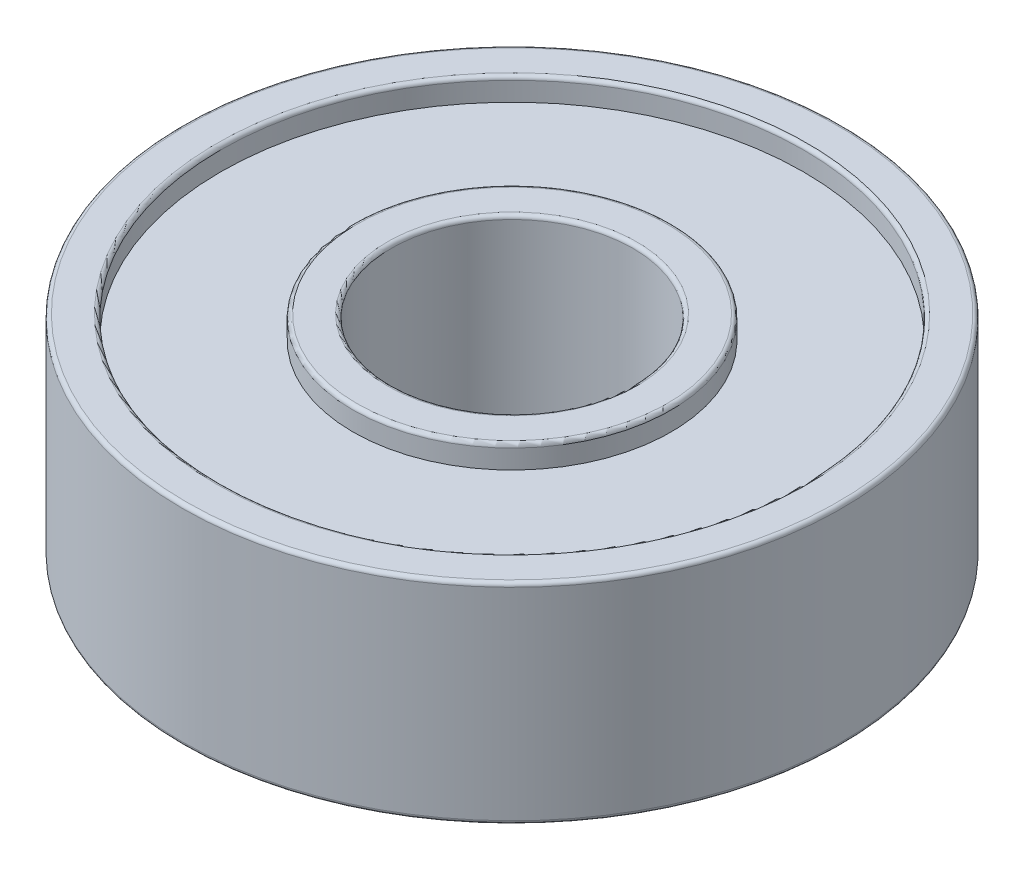
ISO-10303-21;
HEADER;
FILE_DESCRIPTION(('STEP AP214'),'2;1');
FILE_NAME('part.step','',(''),(''),'','','');
FILE_SCHEMA(('AUTOMOTIVE_DESIGN { 1 0 10303 214 1 1 1 1 }'));
ENDSEC;
DATA;
#1=APPLICATION_CONTEXT('core data for automotive mechanical design processes');
#2=APPLICATION_PROTOCOL_DEFINITION('international standard','automotive_design',2000,#1);
#3=PRODUCT_CONTEXT('',#1,'mechanical');
#4=PRODUCT('Part','Part','',(#3));
#5=PRODUCT_RELATED_PRODUCT_CATEGORY('part','',(#4));
#6=PRODUCT_DEFINITION_FORMATION('','',#4);
#7=PRODUCT_DEFINITION_CONTEXT('part definition',#1,'design');
#8=PRODUCT_DEFINITION('design','',#6,#7);
#9=PRODUCT_DEFINITION_SHAPE('','',#8);
#10=(LENGTH_UNIT() NAMED_UNIT(*) SI_UNIT(.MILLI.,.METRE.));
#11=(NAMED_UNIT(*) PLANE_ANGLE_UNIT() SI_UNIT($,.RADIAN.));
#12=(NAMED_UNIT(*) SI_UNIT($,.STERADIAN.) SOLID_ANGLE_UNIT());
#13=UNCERTAINTY_MEASURE_WITH_UNIT(LENGTH_MEASURE(1.E-05),#10,'distance_accuracy_value','');
#14=(GEOMETRIC_REPRESENTATION_CONTEXT(3) GLOBAL_UNCERTAINTY_ASSIGNED_CONTEXT((#13)) GLOBAL_UNIT_ASSIGNED_CONTEXT((#10,
#11,#12)) REPRESENTATION_CONTEXT('',''));
#15=CARTESIAN_POINT('',(0.,0.,0.));
#16=DIRECTION('',(0.,0.,1.));
#17=DIRECTION('',(1.,0.,0.));
#18=AXIS2_PLACEMENT_3D('',#15,#16,#17);
#19=CARTESIAN_POINT('',(0.,-3.5,0.));
#20=DIRECTION('',(0.,1.,0.));
#21=DIRECTION('',(0.,0.,1.));
#22=AXIS2_PLACEMENT_3D('',#19,#20,#21);
#23=PLANE('',#22);
#24=CARTESIAN_POINT('',(0.,-3.5,0.));
#25=DIRECTION('',(0.,1.,0.));
#26=DIRECTION('',(0.,0.,1.));
#27=AXIS2_PLACEMENT_3D('',#24,#25,#26);
#28=CIRCLE('',#27,4.1656);
#29=CARTESIAN_POINT('',(0.,-3.5,4.1656));
#30=VERTEX_POINT('',#29);
#31=EDGE_CURVE('E88',#30,#30,#28,.T.);
#32=ORIENTED_EDGE('',*,*,#31,.T.);
#33=EDGE_LOOP('',(#32));
#34=FACE_BOUND('',#33,.T.);
#35=CARTESIAN_POINT('',(0.,-3.5,0.));
#36=DIRECTION('',(0.,1.,0.));
#37=DIRECTION('',(0.,0.,1.));
#38=AXIS2_PLACEMENT_3D('',#35,#36,#37);
#39=CIRCLE('',#38,5.1816);
#40=CARTESIAN_POINT('',(0.,-3.5,5.1816));
#41=VERTEX_POINT('',#40);
#42=EDGE_CURVE('E91',#41,#41,#39,.F.);
#43=ORIENTED_EDGE('',*,*,#42,.T.);
#44=EDGE_LOOP('',(#43));
#45=FACE_BOUND('',#44,.T.);
#46=ADVANCED_FACE('F38',(#34,#45),#23,.F.);
#47=CARTESIAN_POINT('',(0.,3.5,0.));
#48=DIRECTION('',(0.,1.,0.));
#49=DIRECTION('',(0.,0.,1.));
#50=AXIS2_PLACEMENT_3D('',#47,#48,#49);
#51=PLANE('',#50);
#52=CARTESIAN_POINT('',(0.,3.5,0.));
#53=DIRECTION('',(0.,1.,0.));
#54=DIRECTION('',(0.,0.,1.));
#55=AXIS2_PLACEMENT_3D('',#52,#53,#54);
#56=CIRCLE('',#55,4.1656);
#57=CARTESIAN_POINT('',(0.,3.5,4.1656));
#58=VERTEX_POINT('',#57);
#59=EDGE_CURVE('E76',#58,#58,#56,.F.);
#60=ORIENTED_EDGE('',*,*,#59,.T.);
#61=EDGE_LOOP('',(#60));
#62=FACE_BOUND('',#61,.T.);
#63=CARTESIAN_POINT('',(0.,3.5,0.));
#64=DIRECTION('',(0.,1.,0.));
#65=DIRECTION('',(0.,0.,1.));
#66=AXIS2_PLACEMENT_3D('',#63,#64,#65);
#67=CIRCLE('',#66,5.1816);
#68=CARTESIAN_POINT('',(0.,3.5,5.1816));
#69=VERTEX_POINT('',#68);
#70=EDGE_CURVE('E79',#69,#69,#67,.T.);
#71=ORIENTED_EDGE('',*,*,#70,.T.);
#72=EDGE_LOOP('',(#71));
#73=FACE_BOUND('',#72,.T.);
#74=ADVANCED_FACE('F127',(#62,#73),#51,.T.);
#75=CARTESIAN_POINT('',(0.,-3.5,0.));
#76=DIRECTION('',(0.,1.,0.));
#77=DIRECTION('',(0.,0.,1.));
#78=AXIS2_PLACEMENT_3D('',#75,#76,#77);
#79=CYLINDRICAL_SURFACE('',#78,11.);
#80=CARTESIAN_POINT('',(0.,-3.373,0.));
#81=DIRECTION('',(0.,1.,0.));
#82=DIRECTION('',(0.,0.,1.));
#83=AXIS2_PLACEMENT_3D('',#80,#81,#82);
#84=CIRCLE('',#83,11.);
#85=CARTESIAN_POINT('',(0.,-3.373,11.));
#86=VERTEX_POINT('',#85);
#87=EDGE_CURVE('E58',#86,#86,#84,.T.);
#88=ORIENTED_EDGE('',*,*,#87,.T.);
#89=EDGE_LOOP('',(#88));
#90=FACE_BOUND('',#89,.T.);
#91=CARTESIAN_POINT('',(0.,3.373,0.));
#92=DIRECTION('',(0.,1.,0.));
#93=DIRECTION('',(0.,0.,1.));
#94=AXIS2_PLACEMENT_3D('',#91,#92,#93);
#95=CIRCLE('',#94,11.);
#96=CARTESIAN_POINT('',(0.,3.373,11.));
#97=VERTEX_POINT('',#96);
#98=EDGE_CURVE('E61',#97,#97,#95,.F.);
#99=ORIENTED_EDGE('',*,*,#98,.T.);
#100=EDGE_LOOP('',(#99));
#101=FACE_BOUND('',#100,.T.);
#102=ADVANCED_FACE('F134',(#90,#101),#79,.T.);
#103=CARTESIAN_POINT('',(0.,-3.5,0.));
#104=DIRECTION('',(0.,1.,0.));
#105=DIRECTION('',(0.,0.,1.));
#106=AXIS2_PLACEMENT_3D('',#103,#104,#105);
#107=CIRCLE('',#106,9.857);
#108=CARTESIAN_POINT('',(0.,-3.5,9.857));
#109=VERTEX_POINT('',#108);
#110=EDGE_CURVE('E64',#109,#109,#107,.T.);
#111=ORIENTED_EDGE('',*,*,#110,.T.);
#112=EDGE_LOOP('',(#111));
#113=FACE_BOUND('',#112,.T.);
#114=CARTESIAN_POINT('',(0.,-3.5,0.));
#115=DIRECTION('',(0.,1.,0.));
#116=DIRECTION('',(0.,0.,1.));
#117=AXIS2_PLACEMENT_3D('',#114,#115,#116);
#118=CIRCLE('',#117,10.873);
#119=CARTESIAN_POINT('',(0.,-3.5,10.873));
#120=VERTEX_POINT('',#119);
#121=EDGE_CURVE('E67',#120,#120,#118,.F.);
#122=ORIENTED_EDGE('',*,*,#121,.T.);
#123=EDGE_LOOP('',(#122));
#124=FACE_BOUND('',#123,.T.);
#125=ADVANCED_FACE('F130',(#113,#124),#23,.F.);
#126=CARTESIAN_POINT('',(0.,-3.5,0.));
#127=DIRECTION('',(0.,1.,0.));
#128=DIRECTION('',(0.,0.,1.));
#129=AXIS2_PLACEMENT_3D('',#126,#127,#128);
#130=CYLINDRICAL_SURFACE('',#129,4.0386);
#131=CARTESIAN_POINT('',(0.,-3.373,0.));
#132=DIRECTION('',(0.,1.,0.));
#133=DIRECTION('',(0.,0.,1.));
#134=AXIS2_PLACEMENT_3D('',#131,#132,#133);
#135=CIRCLE('',#134,4.0386);
#136=CARTESIAN_POINT('',(0.,-3.373,4.0386));
#137=VERTEX_POINT('',#136);
#138=EDGE_CURVE('E82',#137,#137,#135,.F.);
#139=ORIENTED_EDGE('',*,*,#138,.T.);
#140=EDGE_LOOP('',(#139));
#141=FACE_BOUND('',#140,.T.);
#142=CARTESIAN_POINT('',(0.,3.373,0.));
#143=DIRECTION('',(0.,1.,0.));
#144=DIRECTION('',(0.,0.,1.));
#145=AXIS2_PLACEMENT_3D('',#142,#143,#144);
#146=CIRCLE('',#145,4.0386);
#147=CARTESIAN_POINT('',(0.,3.373,4.0386));
#148=VERTEX_POINT('',#147);
#149=EDGE_CURVE('E85',#148,#148,#146,.T.);
#150=ORIENTED_EDGE('',*,*,#149,.T.);
#151=EDGE_LOOP('',(#150));
#152=FACE_BOUND('',#151,.T.);
#153=ADVANCED_FACE('F142',(#141,#152),#130,.F.);
#154=CARTESIAN_POINT('',(0.,3.5,0.));
#155=DIRECTION('',(0.,1.,0.));
#156=DIRECTION('',(0.,0.,1.));
#157=AXIS2_PLACEMENT_3D('',#154,#155,#156);
#158=CIRCLE('',#157,9.857);
#159=CARTESIAN_POINT('',(0.,3.5,9.857));
#160=VERTEX_POINT('',#159);
#161=EDGE_CURVE('E10',#160,#160,#158,.F.);
#162=ORIENTED_EDGE('',*,*,#161,.T.);
#163=EDGE_LOOP('',(#162));
#164=FACE_BOUND('',#163,.T.);
#165=CARTESIAN_POINT('',(0.,3.5,0.));
#166=DIRECTION('',(0.,1.,0.));
#167=DIRECTION('',(0.,0.,1.));
#168=AXIS2_PLACEMENT_3D('',#165,#166,#167);
#169=CIRCLE('',#168,10.873);
#170=CARTESIAN_POINT('',(0.,3.5,10.873));
#171=VERTEX_POINT('',#170);
#172=EDGE_CURVE('E45',#171,#171,#169,.T.);
#173=ORIENTED_EDGE('',*,*,#172,.T.);
#174=EDGE_LOOP('',(#173));
#175=FACE_BOUND('',#174,.T.);
#176=ADVANCED_FACE('F137',(#164,#175),#51,.T.);
#177=CARTESIAN_POINT('',(0.,2.738,0.));
#178=DIRECTION('',(0.,1.,0.));
#179=DIRECTION('',(0.,0.,1.));
#180=AXIS2_PLACEMENT_3D('',#177,#178,#179);
#181=CYLINDRICAL_SURFACE('',#180,9.73);
#182=CARTESIAN_POINT('',(0.,3.373,0.));
#183=DIRECTION('',(0.,1.,0.));
#184=DIRECTION('',(0.,0.,1.));
#185=AXIS2_PLACEMENT_3D('',#182,#183,#184);
#186=CIRCLE('',#185,9.73);
#187=CARTESIAN_POINT('',(0.,3.373,9.73));
#188=VERTEX_POINT('',#187);
#189=EDGE_CURVE('E49',#188,#188,#186,.T.);
#190=CARTESIAN_POINT('',(0.,2.738,0.));
#191=DIRECTION('',(0.,1.,0.));
#192=DIRECTION('',(0.,0.,1.));
#193=AXIS2_PLACEMENT_3D('',#190,#191,#192);
#194=CIRCLE('',#193,9.73);
#195=CARTESIAN_POINT('',(0.,2.738,9.73));
#196=VERTEX_POINT('',#195);
#197=EDGE_CURVE('E94',#196,#196,#194,.T.);
#198=CARTESIAN_POINT('',(0.,3.373,9.73));
#199=CARTESIAN_POINT('',(0.,3.36638541666667,9.73));
#200=CARTESIAN_POINT('',(0.,3.35977083333333,9.73));
#201=CARTESIAN_POINT('',(0.,3.34654166666667,9.73));
#202=CARTESIAN_POINT('',(0.,3.33992708333333,9.73));
#203=CARTESIAN_POINT('',(0.,3.32669791666667,9.73));
#204=CARTESIAN_POINT('',(0.,3.32008333333333,9.73));
#205=CARTESIAN_POINT('',(0.,3.30685416666667,9.73));
#206=CARTESIAN_POINT('',(0.,3.30023958333333,9.73));
#207=CARTESIAN_POINT('',(0.,3.28701041666667,9.73));
#208=CARTESIAN_POINT('',(0.,3.28039583333333,9.73));
#209=CARTESIAN_POINT('',(0.,3.26716666666667,9.73));
#210=CARTESIAN_POINT('',(0.,3.26055208333333,9.73));
#211=CARTESIAN_POINT('',(0.,3.24732291666667,9.73));
#212=CARTESIAN_POINT('',(0.,3.24070833333333,9.73));
#213=CARTESIAN_POINT('',(0.,3.22747916666667,9.73));
#214=CARTESIAN_POINT('',(0.,3.22086458333333,9.73));
#215=CARTESIAN_POINT('',(0.,3.20763541666667,9.73));
#216=CARTESIAN_POINT('',(0.,3.20102083333333,9.73));
#217=CARTESIAN_POINT('',(0.,3.18779166666667,9.73));
#218=CARTESIAN_POINT('',(0.,3.18117708333333,9.73));
#219=CARTESIAN_POINT('',(0.,3.16794791666667,9.73));
#220=CARTESIAN_POINT('',(0.,3.16133333333333,9.73));
#221=CARTESIAN_POINT('',(0.,3.14810416666667,9.73));
#222=CARTESIAN_POINT('',(0.,3.14148958333333,9.73));
#223=CARTESIAN_POINT('',(0.,3.12826041666667,9.73));
#224=CARTESIAN_POINT('',(0.,3.12164583333333,9.73));
#225=CARTESIAN_POINT('',(0.,3.10841666666667,9.73));
#226=CARTESIAN_POINT('',(0.,3.10180208333333,9.73));
#227=CARTESIAN_POINT('',(0.,3.08857291666667,9.73));
#228=CARTESIAN_POINT('',(0.,3.08195833333333,9.73));
#229=CARTESIAN_POINT('',(0.,3.06872916666667,9.73));
#230=CARTESIAN_POINT('',(0.,3.06211458333333,9.73));
#231=CARTESIAN_POINT('',(0.,3.04888541666667,9.73));
#232=CARTESIAN_POINT('',(0.,3.04227083333333,9.73));
#233=CARTESIAN_POINT('',(0.,3.02904166666667,9.73));
#234=CARTESIAN_POINT('',(0.,3.02242708333333,9.73));
#235=CARTESIAN_POINT('',(0.,3.00919791666667,9.73));
#236=CARTESIAN_POINT('',(0.,3.00258333333333,9.73));
#237=CARTESIAN_POINT('',(0.,2.98935416666667,9.73));
#238=CARTESIAN_POINT('',(0.,2.98273958333333,9.73));
#239=CARTESIAN_POINT('',(0.,2.96951041666667,9.73));
#240=CARTESIAN_POINT('',(0.,2.96289583333333,9.73));
#241=CARTESIAN_POINT('',(0.,2.94966666666667,9.73));
#242=CARTESIAN_POINT('',(0.,2.94305208333333,9.73));
#243=CARTESIAN_POINT('',(0.,2.92982291666667,9.73));
#244=CARTESIAN_POINT('',(0.,2.92320833333333,9.73));
#245=CARTESIAN_POINT('',(0.,2.90997916666667,9.73));
#246=CARTESIAN_POINT('',(0.,2.90336458333333,9.73));
#247=CARTESIAN_POINT('',(0.,2.89013541666667,9.73));
#248=CARTESIAN_POINT('',(0.,2.88352083333333,9.73));
#249=CARTESIAN_POINT('',(0.,2.87029166666667,9.73));
#250=CARTESIAN_POINT('',(0.,2.86367708333333,9.73));
#251=CARTESIAN_POINT('',(0.,2.85044791666667,9.73));
#252=CARTESIAN_POINT('',(0.,2.84383333333333,9.73));
#253=CARTESIAN_POINT('',(0.,2.83060416666667,9.73));
#254=CARTESIAN_POINT('',(0.,2.82398958333333,9.73));
#255=CARTESIAN_POINT('',(0.,2.81076041666667,9.73));
#256=CARTESIAN_POINT('',(0.,2.80414583333333,9.73));
#257=CARTESIAN_POINT('',(0.,2.79091666666667,9.73));
#258=CARTESIAN_POINT('',(0.,2.78430208333333,9.73));
#259=CARTESIAN_POINT('',(0.,2.77107291666667,9.73));
#260=CARTESIAN_POINT('',(0.,2.76445833333333,9.73));
#261=CARTESIAN_POINT('',(0.,2.75122916666667,9.73));
#262=CARTESIAN_POINT('',(0.,2.74461458333333,9.73));
#263=CARTESIAN_POINT('',(0.,2.738,9.73));
#264=B_SPLINE_CURVE_WITH_KNOTS('',3,(#198,#199,#200,#201,#202,#203,#204,#205,#206,#207,#208,
#209,#210,#211,#212,#213,#214,#215,#216,#217,#218,#219,#220,#221,#222,#223,#224,#225,#226,#227,
#228,#229,#230,#231,#232,#233,#234,#235,#236,#237,#238,#239,#240,#241,#242,#243,#244,#245,#246,
#247,#248,#249,#250,#251,#252,#253,#254,#255,#256,#257,#258,#259,#260,#261,#262,#263),
.UNSPECIFIED.,.F.,.F.,(4,2,2,2,2,2,2,2,2,2,2,2,2,2,2,2,2,2,2,2,2,2,2,2,2,2,2,2,2,2,2,2,4),(0.,
0.0198437499999999,0.0396874999999998,0.0595312500000001,0.079375,0.0992187499999999,0.1190625,
0.13890625,0.15875,0.17859375,0.1984375,0.21828125,0.238125,0.25796875,0.2778125,0.29765625,
0.3175,0.33734375,0.3571875,0.37703125,0.396875,0.41671875,0.4365625,0.45640625,0.47625,
0.49609375,0.5159375,0.53578125,0.555625,0.57546875,0.5953125,0.61515625,0.635),.UNSPECIFIED.);
#265=EDGE_CURVE('BSEAM233',#188,#196,#264,.T.);
#266=ORIENTED_EDGE('',*,*,#189,.T.);
#267=ORIENTED_EDGE('',*,*,#197,.F.);
#268=ORIENTED_EDGE('',*,*,#265,.T.);
#269=ORIENTED_EDGE('',*,*,#265,.F.);
#270=EDGE_LOOP('',(#266,#268,#267,#269));
#271=FACE_BOUND('',#270,.T.);
#272=ADVANCED_FACE('F233',(#271),#181,.F.);
#273=CARTESIAN_POINT('',(0.,2.738,0.));
#274=DIRECTION('',(0.,1.,0.));
#275=DIRECTION('',(0.,0.,1.));
#276=AXIS2_PLACEMENT_3D('',#273,#274,#275);
#277=PLANE('',#276);
#278=CARTESIAN_POINT('',(0.,2.738,0.));
#279=DIRECTION('',(0.,1.,0.));
#280=DIRECTION('',(0.,0.,1.));
#281=AXIS2_PLACEMENT_3D('',#278,#279,#280);
#282=CIRCLE('',#281,5.3086);
#283=CARTESIAN_POINT('',(0.,2.738,5.3086));
#284=VERTEX_POINT('',#283);
#285=EDGE_CURVE('E97',#284,#284,#282,.T.);
#286=ORIENTED_EDGE('',*,*,#285,.F.);
#287=EDGE_LOOP('',(#286));
#288=FACE_BOUND('',#287,.T.);
#289=ORIENTED_EDGE('',*,*,#197,.T.);
#290=EDGE_LOOP('',(#289));
#291=FACE_BOUND('',#290,.T.);
#292=ADVANCED_FACE('F123',(#288,#291),#277,.T.);
#293=CARTESIAN_POINT('',(0.,2.738,0.));
#294=DIRECTION('',(0.,1.,0.));
#295=DIRECTION('',(0.,0.,1.));
#296=AXIS2_PLACEMENT_3D('',#293,#294,#295);
#297=CYLINDRICAL_SURFACE('',#296,5.3086);
#298=CARTESIAN_POINT('',(0.,3.373,0.));
#299=DIRECTION('',(0.,1.,0.));
#300=DIRECTION('',(0.,0.,1.));
#301=AXIS2_PLACEMENT_3D('',#298,#299,#300);
#302=CIRCLE('',#301,5.3086);
#303=CARTESIAN_POINT('',(0.,3.373,5.3086));
#304=VERTEX_POINT('',#303);
#305=EDGE_CURVE('E53',#304,#304,#302,.F.);
#306=CARTESIAN_POINT('',(0.,3.373,5.3086));
#307=CARTESIAN_POINT('',(0.,3.36638541666667,5.3086));
#308=CARTESIAN_POINT('',(0.,3.35977083333333,5.3086));
#309=CARTESIAN_POINT('',(0.,3.34654166666667,5.3086));
#310=CARTESIAN_POINT('',(0.,3.33992708333333,5.3086));
#311=CARTESIAN_POINT('',(0.,3.32669791666667,5.3086));
#312=CARTESIAN_POINT('',(0.,3.32008333333333,5.3086));
#313=CARTESIAN_POINT('',(0.,3.30685416666667,5.3086));
#314=CARTESIAN_POINT('',(0.,3.30023958333333,5.3086));
#315=CARTESIAN_POINT('',(0.,3.28701041666667,5.3086));
#316=CARTESIAN_POINT('',(0.,3.28039583333333,5.3086));
#317=CARTESIAN_POINT('',(0.,3.26716666666667,5.3086));
#318=CARTESIAN_POINT('',(0.,3.26055208333333,5.3086));
#319=CARTESIAN_POINT('',(0.,3.24732291666667,5.3086));
#320=CARTESIAN_POINT('',(0.,3.24070833333333,5.3086));
#321=CARTESIAN_POINT('',(0.,3.22747916666667,5.3086));
#322=CARTESIAN_POINT('',(0.,3.22086458333333,5.3086));
#323=CARTESIAN_POINT('',(0.,3.20763541666667,5.3086));
#324=CARTESIAN_POINT('',(0.,3.20102083333333,5.3086));
#325=CARTESIAN_POINT('',(0.,3.18779166666667,5.3086));
#326=CARTESIAN_POINT('',(0.,3.18117708333333,5.3086));
#327=CARTESIAN_POINT('',(0.,3.16794791666667,5.3086));
#328=CARTESIAN_POINT('',(0.,3.16133333333333,5.3086));
#329=CARTESIAN_POINT('',(0.,3.14810416666667,5.3086));
#330=CARTESIAN_POINT('',(0.,3.14148958333333,5.3086));
#331=CARTESIAN_POINT('',(0.,3.12826041666667,5.3086));
#332=CARTESIAN_POINT('',(0.,3.12164583333333,5.3086));
#333=CARTESIAN_POINT('',(0.,3.10841666666667,5.3086));
#334=CARTESIAN_POINT('',(0.,3.10180208333333,5.3086));
#335=CARTESIAN_POINT('',(0.,3.08857291666667,5.3086));
#336=CARTESIAN_POINT('',(0.,3.08195833333333,5.3086));
#337=CARTESIAN_POINT('',(0.,3.06872916666667,5.3086));
#338=CARTESIAN_POINT('',(0.,3.06211458333333,5.3086));
#339=CARTESIAN_POINT('',(0.,3.04888541666667,5.3086));
#340=CARTESIAN_POINT('',(0.,3.04227083333333,5.3086));
#341=CARTESIAN_POINT('',(0.,3.02904166666667,5.3086));
#342=CARTESIAN_POINT('',(0.,3.02242708333333,5.3086));
#343=CARTESIAN_POINT('',(0.,3.00919791666667,5.3086));
#344=CARTESIAN_POINT('',(0.,3.00258333333333,5.3086));
#345=CARTESIAN_POINT('',(0.,2.98935416666667,5.3086));
#346=CARTESIAN_POINT('',(0.,2.98273958333333,5.3086));
#347=CARTESIAN_POINT('',(0.,2.96951041666667,5.3086));
#348=CARTESIAN_POINT('',(0.,2.96289583333333,5.3086));
#349=CARTESIAN_POINT('',(0.,2.94966666666667,5.3086));
#350=CARTESIAN_POINT('',(0.,2.94305208333333,5.3086));
#351=CARTESIAN_POINT('',(0.,2.92982291666667,5.3086));
#352=CARTESIAN_POINT('',(0.,2.92320833333333,5.3086));
#353=CARTESIAN_POINT('',(0.,2.90997916666667,5.3086));
#354=CARTESIAN_POINT('',(0.,2.90336458333333,5.3086));
#355=CARTESIAN_POINT('',(0.,2.89013541666667,5.3086));
#356=CARTESIAN_POINT('',(0.,2.88352083333333,5.3086));
#357=CARTESIAN_POINT('',(0.,2.87029166666667,5.3086));
#358=CARTESIAN_POINT('',(0.,2.86367708333333,5.3086));
#359=CARTESIAN_POINT('',(0.,2.85044791666667,5.3086));
#360=CARTESIAN_POINT('',(0.,2.84383333333333,5.3086));
#361=CARTESIAN_POINT('',(0.,2.83060416666667,5.3086));
#362=CARTESIAN_POINT('',(0.,2.82398958333333,5.3086));
#363=CARTESIAN_POINT('',(0.,2.81076041666667,5.3086));
#364=CARTESIAN_POINT('',(0.,2.80414583333333,5.3086));
#365=CARTESIAN_POINT('',(0.,2.79091666666667,5.3086));
#366=CARTESIAN_POINT('',(0.,2.78430208333333,5.3086));
#367=CARTESIAN_POINT('',(0.,2.77107291666667,5.3086));
#368=CARTESIAN_POINT('',(0.,2.76445833333333,5.3086));
#369=CARTESIAN_POINT('',(0.,2.75122916666667,5.3086));
#370=CARTESIAN_POINT('',(0.,2.74461458333333,5.3086));
#371=CARTESIAN_POINT('',(0.,2.738,5.3086));
#372=B_SPLINE_CURVE_WITH_KNOTS('',3,(#306,#307,#308,#309,#310,#311,#312,#313,#314,#315,#316,
#317,#318,#319,#320,#321,#322,#323,#324,#325,#326,#327,#328,#329,#330,#331,#332,#333,#334,#335,
#336,#337,#338,#339,#340,#341,#342,#343,#344,#345,#346,#347,#348,#349,#350,#351,#352,#353,#354,
#355,#356,#357,#358,#359,#360,#361,#362,#363,#364,#365,#366,#367,#368,#369,#370,#371),
.UNSPECIFIED.,.F.,.F.,(4,2,2,2,2,2,2,2,2,2,2,2,2,2,2,2,2,2,2,2,2,2,2,2,2,2,2,2,2,2,2,2,4),(0.,
0.0198437499999999,0.0396874999999998,0.0595312500000001,0.079375,0.0992187499999999,0.1190625,
0.13890625,0.15875,0.17859375,0.1984375,0.21828125,0.238125,0.25796875,0.2778125,0.29765625,
0.3175,0.33734375,0.3571875,0.37703125,0.396875,0.41671875,0.4365625,0.45640625,0.47625,
0.49609375,0.5159375,0.53578125,0.555625,0.57546875,0.5953125,0.61515625,0.635),.UNSPECIFIED.);
#373=EDGE_CURVE('BSEAM117',#304,#284,#372,.T.);
#374=ORIENTED_EDGE('',*,*,#305,.T.);
#375=ORIENTED_EDGE('',*,*,#285,.T.);
#376=ORIENTED_EDGE('',*,*,#373,.T.);
#377=ORIENTED_EDGE('',*,*,#373,.F.);
#378=EDGE_LOOP('',(#374,#376,#375,#377));
#379=FACE_BOUND('',#378,.T.);
#380=ADVANCED_FACE('F117',(#379),#297,.T.);
#381=CARTESIAN_POINT('',(0.,-2.738,0.));
#382=DIRECTION('',(0.,-1.,0.));
#383=DIRECTION('',(0.,0.,-1.));
#384=AXIS2_PLACEMENT_3D('',#381,#382,#383);
#385=CYLINDRICAL_SURFACE('',#384,9.73);
#386=CARTESIAN_POINT('',(0.,-3.373,0.));
#387=DIRECTION('',(0.,1.,0.));
#388=DIRECTION('',(0.,0.,1.));
#389=AXIS2_PLACEMENT_3D('',#386,#387,#388);
#390=CIRCLE('',#389,9.73);
#391=CARTESIAN_POINT('',(0.,-3.373,-9.73));
#392=VERTEX_POINT('',#391);
#393=EDGE_CURVE('E70',#392,#392,#390,.F.);
#394=CARTESIAN_POINT('',(0.,-2.738,0.));
#395=DIRECTION('',(0.,-1.,0.));
#396=DIRECTION('',(0.,0.,-1.));
#397=AXIS2_PLACEMENT_3D('',#394,#395,#396);
#398=CIRCLE('',#397,9.73);
#399=CARTESIAN_POINT('',(0.,-2.738,-9.73));
#400=VERTEX_POINT('',#399);
#401=EDGE_CURVE('E100',#400,#400,#398,.T.);
#402=CARTESIAN_POINT('',(0.,-3.373,-9.73));
#403=CARTESIAN_POINT('',(0.,-3.36638541666667,-9.73));
#404=CARTESIAN_POINT('',(0.,-3.35977083333333,-9.73));
#405=CARTESIAN_POINT('',(0.,-3.34654166666667,-9.73));
#406=CARTESIAN_POINT('',(0.,-3.33992708333333,-9.73));
#407=CARTESIAN_POINT('',(0.,-3.32669791666667,-9.73));
#408=CARTESIAN_POINT('',(0.,-3.32008333333333,-9.73));
#409=CARTESIAN_POINT('',(0.,-3.30685416666667,-9.73));
#410=CARTESIAN_POINT('',(0.,-3.30023958333333,-9.73));
#411=CARTESIAN_POINT('',(0.,-3.28701041666667,-9.73));
#412=CARTESIAN_POINT('',(0.,-3.28039583333333,-9.73));
#413=CARTESIAN_POINT('',(0.,-3.26716666666667,-9.73));
#414=CARTESIAN_POINT('',(0.,-3.26055208333333,-9.73));
#415=CARTESIAN_POINT('',(0.,-3.24732291666667,-9.73));
#416=CARTESIAN_POINT('',(0.,-3.24070833333333,-9.73));
#417=CARTESIAN_POINT('',(0.,-3.22747916666667,-9.73));
#418=CARTESIAN_POINT('',(0.,-3.22086458333333,-9.73));
#419=CARTESIAN_POINT('',(0.,-3.20763541666667,-9.73));
#420=CARTESIAN_POINT('',(0.,-3.20102083333333,-9.73));
#421=CARTESIAN_POINT('',(0.,-3.18779166666667,-9.73));
#422=CARTESIAN_POINT('',(0.,-3.18117708333333,-9.73));
#423=CARTESIAN_POINT('',(0.,-3.16794791666667,-9.73));
#424=CARTESIAN_POINT('',(0.,-3.16133333333333,-9.73));
#425=CARTESIAN_POINT('',(0.,-3.14810416666667,-9.73));
#426=CARTESIAN_POINT('',(0.,-3.14148958333333,-9.73));
#427=CARTESIAN_POINT('',(0.,-3.12826041666667,-9.73));
#428=CARTESIAN_POINT('',(0.,-3.12164583333333,-9.73));
#429=CARTESIAN_POINT('',(0.,-3.10841666666667,-9.73));
#430=CARTESIAN_POINT('',(0.,-3.10180208333333,-9.73));
#431=CARTESIAN_POINT('',(0.,-3.08857291666667,-9.73));
#432=CARTESIAN_POINT('',(0.,-3.08195833333333,-9.73));
#433=CARTESIAN_POINT('',(0.,-3.06872916666667,-9.73));
#434=CARTESIAN_POINT('',(0.,-3.06211458333333,-9.73));
#435=CARTESIAN_POINT('',(0.,-3.04888541666667,-9.73));
#436=CARTESIAN_POINT('',(0.,-3.04227083333333,-9.73));
#437=CARTESIAN_POINT('',(0.,-3.02904166666667,-9.73));
#438=CARTESIAN_POINT('',(0.,-3.02242708333333,-9.73));
#439=CARTESIAN_POINT('',(0.,-3.00919791666667,-9.73));
#440=CARTESIAN_POINT('',(0.,-3.00258333333333,-9.73));
#441=CARTESIAN_POINT('',(0.,-2.98935416666667,-9.73));
#442=CARTESIAN_POINT('',(0.,-2.98273958333333,-9.73));
#443=CARTESIAN_POINT('',(0.,-2.96951041666667,-9.73));
#444=CARTESIAN_POINT('',(0.,-2.96289583333333,-9.73));
#445=CARTESIAN_POINT('',(0.,-2.94966666666667,-9.73));
#446=CARTESIAN_POINT('',(0.,-2.94305208333333,-9.73));
#447=CARTESIAN_POINT('',(0.,-2.92982291666667,-9.73));
#448=CARTESIAN_POINT('',(0.,-2.92320833333333,-9.73));
#449=CARTESIAN_POINT('',(0.,-2.90997916666667,-9.73));
#450=CARTESIAN_POINT('',(0.,-2.90336458333333,-9.73));
#451=CARTESIAN_POINT('',(0.,-2.89013541666667,-9.73));
#452=CARTESIAN_POINT('',(0.,-2.88352083333333,-9.73));
#453=CARTESIAN_POINT('',(0.,-2.87029166666667,-9.73));
#454=CARTESIAN_POINT('',(0.,-2.86367708333333,-9.73));
#455=CARTESIAN_POINT('',(0.,-2.85044791666667,-9.73));
#456=CARTESIAN_POINT('',(0.,-2.84383333333333,-9.73));
#457=CARTESIAN_POINT('',(0.,-2.83060416666667,-9.73));
#458=CARTESIAN_POINT('',(0.,-2.82398958333333,-9.73));
#459=CARTESIAN_POINT('',(0.,-2.81076041666667,-9.73));
#460=CARTESIAN_POINT('',(0.,-2.80414583333333,-9.73));
#461=CARTESIAN_POINT('',(0.,-2.79091666666667,-9.73));
#462=CARTESIAN_POINT('',(0.,-2.78430208333333,-9.73));
#463=CARTESIAN_POINT('',(0.,-2.77107291666667,-9.73));
#464=CARTESIAN_POINT('',(0.,-2.76445833333333,-9.73));
#465=CARTESIAN_POINT('',(0.,-2.75122916666667,-9.73));
#466=CARTESIAN_POINT('',(0.,-2.74461458333333,-9.73));
#467=CARTESIAN_POINT('',(0.,-2.738,-9.73));
#468=B_SPLINE_CURVE_WITH_KNOTS('',3,(#402,#403,#404,#405,#406,#407,#408,#409,#410,#411,#412,
#413,#414,#415,#416,#417,#418,#419,#420,#421,#422,#423,#424,#425,#426,#427,#428,#429,#430,#431,
#432,#433,#434,#435,#436,#437,#438,#439,#440,#441,#442,#443,#444,#445,#446,#447,#448,#449,#450,
#451,#452,#453,#454,#455,#456,#457,#458,#459,#460,#461,#462,#463,#464,#465,#466,#467),
.UNSPECIFIED.,.F.,.F.,(4,2,2,2,2,2,2,2,2,2,2,2,2,2,2,2,2,2,2,2,2,2,2,2,2,2,2,2,2,2,2,2,4),(0.,
0.0198437500000003,0.0396875000000002,0.0595312500000001,0.079375,0.0992187500000004,0.1190625,
0.13890625,0.15875,0.17859375,0.1984375,0.21828125,0.238125,0.25796875,0.2778125,
0.297656250000001,0.317500000000001,0.33734375,0.3571875,0.377031250000001,0.396875000000001,
0.41671875,0.436562500000001,0.456406250000001,0.476250000000001,0.496093750000001,
0.515937500000001,0.535781250000001,0.555625000000001,0.575468750000001,0.595312500000001,
0.615156250000001,0.635000000000001),.UNSPECIFIED.);
#469=EDGE_CURVE('BSEAM112',#392,#400,#468,.T.);
#470=ORIENTED_EDGE('',*,*,#393,.T.);
#471=ORIENTED_EDGE('',*,*,#401,.F.);
#472=ORIENTED_EDGE('',*,*,#469,.T.);
#473=ORIENTED_EDGE('',*,*,#469,.F.);
#474=EDGE_LOOP('',(#470,#472,#471,#473));
#475=FACE_BOUND('',#474,.T.);
#476=ADVANCED_FACE('F112',(#475),#385,.F.);
#477=CARTESIAN_POINT('',(0.,-2.738,0.));
#478=DIRECTION('',(0.,-1.,0.));
#479=DIRECTION('',(0.,0.,-1.));
#480=AXIS2_PLACEMENT_3D('',#477,#478,#479);
#481=PLANE('',#480);
#482=CARTESIAN_POINT('',(0.,-2.738,0.));
#483=DIRECTION('',(0.,-1.,0.));
#484=DIRECTION('',(0.,0.,-1.));
#485=AXIS2_PLACEMENT_3D('',#482,#483,#484);
#486=CIRCLE('',#485,5.3086);
#487=CARTESIAN_POINT('',(0.,-2.738,-5.3086));
#488=VERTEX_POINT('',#487);
#489=EDGE_CURVE('E103',#488,#488,#486,.T.);
#490=ORIENTED_EDGE('',*,*,#489,.F.);
#491=EDGE_LOOP('',(#490));
#492=FACE_BOUND('',#491,.T.);
#493=ORIENTED_EDGE('',*,*,#401,.T.);
#494=EDGE_LOOP('',(#493));
#495=FACE_BOUND('',#494,.T.);
#496=ADVANCED_FACE('F109',(#492,#495),#481,.T.);
#497=CARTESIAN_POINT('',(0.,-2.738,0.));
#498=DIRECTION('',(0.,-1.,0.));
#499=DIRECTION('',(0.,0.,-1.));
#500=AXIS2_PLACEMENT_3D('',#497,#498,#499);
#501=CYLINDRICAL_SURFACE('',#500,5.3086);
#502=CARTESIAN_POINT('',(0.,-3.373,0.));
#503=DIRECTION('',(0.,1.,0.));
#504=DIRECTION('',(0.,0.,1.));
#505=AXIS2_PLACEMENT_3D('',#502,#503,#504);
#506=CIRCLE('',#505,5.3086);
#507=CARTESIAN_POINT('',(0.,-3.373,-5.3086));
#508=VERTEX_POINT('',#507);
#509=EDGE_CURVE('E73',#508,#508,#506,.T.);
#510=CARTESIAN_POINT('',(0.,-3.373,-5.3086));
#511=CARTESIAN_POINT('',(0.,-3.36638541666667,-5.3086));
#512=CARTESIAN_POINT('',(0.,-3.35977083333333,-5.3086));
#513=CARTESIAN_POINT('',(0.,-3.34654166666667,-5.3086));
#514=CARTESIAN_POINT('',(0.,-3.33992708333333,-5.3086));
#515=CARTESIAN_POINT('',(0.,-3.32669791666667,-5.3086));
#516=CARTESIAN_POINT('',(0.,-3.32008333333333,-5.3086));
#517=CARTESIAN_POINT('',(0.,-3.30685416666667,-5.3086));
#518=CARTESIAN_POINT('',(0.,-3.30023958333333,-5.3086));
#519=CARTESIAN_POINT('',(0.,-3.28701041666667,-5.3086));
#520=CARTESIAN_POINT('',(0.,-3.28039583333333,-5.3086));
#521=CARTESIAN_POINT('',(0.,-3.26716666666667,-5.3086));
#522=CARTESIAN_POINT('',(0.,-3.26055208333333,-5.3086));
#523=CARTESIAN_POINT('',(0.,-3.24732291666667,-5.3086));
#524=CARTESIAN_POINT('',(0.,-3.24070833333333,-5.3086));
#525=CARTESIAN_POINT('',(0.,-3.22747916666667,-5.3086));
#526=CARTESIAN_POINT('',(0.,-3.22086458333333,-5.3086));
#527=CARTESIAN_POINT('',(0.,-3.20763541666667,-5.3086));
#528=CARTESIAN_POINT('',(0.,-3.20102083333333,-5.3086));
#529=CARTESIAN_POINT('',(0.,-3.18779166666667,-5.3086));
#530=CARTESIAN_POINT('',(0.,-3.18117708333333,-5.3086));
#531=CARTESIAN_POINT('',(0.,-3.16794791666667,-5.3086));
#532=CARTESIAN_POINT('',(0.,-3.16133333333333,-5.3086));
#533=CARTESIAN_POINT('',(0.,-3.14810416666667,-5.3086));
#534=CARTESIAN_POINT('',(0.,-3.14148958333333,-5.3086));
#535=CARTESIAN_POINT('',(0.,-3.12826041666667,-5.3086));
#536=CARTESIAN_POINT('',(0.,-3.12164583333333,-5.3086));
#537=CARTESIAN_POINT('',(0.,-3.10841666666667,-5.3086));
#538=CARTESIAN_POINT('',(0.,-3.10180208333333,-5.3086));
#539=CARTESIAN_POINT('',(0.,-3.08857291666667,-5.3086));
#540=CARTESIAN_POINT('',(0.,-3.08195833333333,-5.3086));
#541=CARTESIAN_POINT('',(0.,-3.06872916666667,-5.3086));
#542=CARTESIAN_POINT('',(0.,-3.06211458333333,-5.3086));
#543=CARTESIAN_POINT('',(0.,-3.04888541666667,-5.3086));
#544=CARTESIAN_POINT('',(0.,-3.04227083333333,-5.3086));
#545=CARTESIAN_POINT('',(0.,-3.02904166666667,-5.3086));
#546=CARTESIAN_POINT('',(0.,-3.02242708333333,-5.3086));
#547=CARTESIAN_POINT('',(0.,-3.00919791666667,-5.3086));
#548=CARTESIAN_POINT('',(0.,-3.00258333333333,-5.3086));
#549=CARTESIAN_POINT('',(0.,-2.98935416666667,-5.3086));
#550=CARTESIAN_POINT('',(0.,-2.98273958333333,-5.3086));
#551=CARTESIAN_POINT('',(0.,-2.96951041666667,-5.3086));
#552=CARTESIAN_POINT('',(0.,-2.96289583333333,-5.3086));
#553=CARTESIAN_POINT('',(0.,-2.94966666666667,-5.3086));
#554=CARTESIAN_POINT('',(0.,-2.94305208333333,-5.3086));
#555=CARTESIAN_POINT('',(0.,-2.92982291666667,-5.3086));
#556=CARTESIAN_POINT('',(0.,-2.92320833333333,-5.3086));
#557=CARTESIAN_POINT('',(0.,-2.90997916666667,-5.3086));
#558=CARTESIAN_POINT('',(0.,-2.90336458333333,-5.3086));
#559=CARTESIAN_POINT('',(0.,-2.89013541666667,-5.3086));
#560=CARTESIAN_POINT('',(0.,-2.88352083333333,-5.3086));
#561=CARTESIAN_POINT('',(0.,-2.87029166666667,-5.3086));
#562=CARTESIAN_POINT('',(0.,-2.86367708333333,-5.3086));
#563=CARTESIAN_POINT('',(0.,-2.85044791666667,-5.3086));
#564=CARTESIAN_POINT('',(0.,-2.84383333333333,-5.3086));
#565=CARTESIAN_POINT('',(0.,-2.83060416666667,-5.3086));
#566=CARTESIAN_POINT('',(0.,-2.82398958333333,-5.3086));
#567=CARTESIAN_POINT('',(0.,-2.81076041666667,-5.3086));
#568=CARTESIAN_POINT('',(0.,-2.80414583333333,-5.3086));
#569=CARTESIAN_POINT('',(0.,-2.79091666666667,-5.3086));
#570=CARTESIAN_POINT('',(0.,-2.78430208333333,-5.3086));
#571=CARTESIAN_POINT('',(0.,-2.77107291666667,-5.3086));
#572=CARTESIAN_POINT('',(0.,-2.76445833333333,-5.3086));
#573=CARTESIAN_POINT('',(0.,-2.75122916666667,-5.3086));
#574=CARTESIAN_POINT('',(0.,-2.74461458333333,-5.3086));
#575=CARTESIAN_POINT('',(0.,-2.738,-5.3086));
#576=B_SPLINE_CURVE_WITH_KNOTS('',3,(#510,#511,#512,#513,#514,#515,#516,#517,#518,#519,#520,
#521,#522,#523,#524,#525,#526,#527,#528,#529,#530,#531,#532,#533,#534,#535,#536,#537,#538,#539,
#540,#541,#542,#543,#544,#545,#546,#547,#548,#549,#550,#551,#552,#553,#554,#555,#556,#557,#558,
#559,#560,#561,#562,#563,#564,#565,#566,#567,#568,#569,#570,#571,#572,#573,#574,#575),
.UNSPECIFIED.,.F.,.F.,(4,2,2,2,2,2,2,2,2,2,2,2,2,2,2,2,2,2,2,2,2,2,2,2,2,2,2,2,2,2,2,2,4),(0.,
0.0198437500000003,0.0396875000000002,0.0595312500000001,0.079375,0.0992187500000004,0.1190625,
0.13890625,0.15875,0.17859375,0.1984375,0.21828125,0.238125,0.25796875,0.2778125,
0.297656250000001,0.317500000000001,0.33734375,0.3571875,0.377031250000001,0.396875000000001,
0.41671875,0.436562500000001,0.456406250000001,0.476250000000001,0.496093750000001,
0.515937500000001,0.535781250000001,0.555625000000001,0.575468750000001,0.595312500000001,
0.615156250000001,0.635000000000001),.UNSPECIFIED.);
#577=EDGE_CURVE('BSEAM107',#508,#488,#576,.T.);
#578=ORIENTED_EDGE('',*,*,#509,.T.);
#579=ORIENTED_EDGE('',*,*,#489,.T.);
#580=ORIENTED_EDGE('',*,*,#577,.T.);
#581=ORIENTED_EDGE('',*,*,#577,.F.);
#582=EDGE_LOOP('',(#578,#580,#579,#581));
#583=FACE_BOUND('',#582,.T.);
#584=ADVANCED_FACE('F107',(#583),#501,.T.);
#585=CARTESIAN_POINT('',(0.,-3.373,0.));
#586=DIRECTION('',(0.,1.,0.));
#587=DIRECTION('',(0.,0.,1.));
#588=AXIS2_PLACEMENT_3D('',#585,#586,#587);
#589=TOROIDAL_SURFACE('',#588,4.1656,0.127);
#590=ORIENTED_EDGE('',*,*,#138,.F.);
#591=EDGE_LOOP('',(#590));
#592=FACE_BOUND('',#591,.T.);
#593=ORIENTED_EDGE('',*,*,#31,.F.);
#594=EDGE_LOOP('',(#593));
#595=FACE_BOUND('',#594,.T.);
#596=ADVANCED_FACE('F188',(#592,#595),#589,.T.);
#597=CARTESIAN_POINT('',(0.,3.373,0.));
#598=DIRECTION('',(0.,1.,0.));
#599=DIRECTION('',(0.,0.,1.));
#600=AXIS2_PLACEMENT_3D('',#597,#598,#599);
#601=TOROIDAL_SURFACE('',#600,4.1656,0.127);
#602=ORIENTED_EDGE('',*,*,#59,.F.);
#603=EDGE_LOOP('',(#602));
#604=FACE_BOUND('',#603,.T.);
#605=ORIENTED_EDGE('',*,*,#149,.F.);
#606=EDGE_LOOP('',(#605));
#607=FACE_BOUND('',#606,.T.);
#608=ADVANCED_FACE('F184',(#604,#607),#601,.T.);
#609=CARTESIAN_POINT('',(0.,-3.373,0.));
#610=DIRECTION('',(0.,1.,0.));
#611=DIRECTION('',(0.,0.,1.));
#612=AXIS2_PLACEMENT_3D('',#609,#610,#611);
#613=TOROIDAL_SURFACE('',#612,5.1816,0.127);
#614=ORIENTED_EDGE('',*,*,#509,.F.);
#615=EDGE_LOOP('',(#614));
#616=FACE_BOUND('',#615,.T.);
#617=ORIENTED_EDGE('',*,*,#42,.F.);
#618=EDGE_LOOP('',(#617));
#619=FACE_BOUND('',#618,.T.);
#620=ADVANCED_FACE('F180',(#616,#619),#613,.T.);
#621=CARTESIAN_POINT('',(0.,-3.373,0.));
#622=DIRECTION('',(0.,1.,0.));
#623=DIRECTION('',(0.,0.,1.));
#624=AXIS2_PLACEMENT_3D('',#621,#622,#623);
#625=TOROIDAL_SURFACE('',#624,9.857,0.127);
#626=ORIENTED_EDGE('',*,*,#110,.F.);
#627=EDGE_LOOP('',(#626));
#628=FACE_BOUND('',#627,.T.);
#629=ORIENTED_EDGE('',*,*,#393,.F.);
#630=EDGE_LOOP('',(#629));
#631=FACE_BOUND('',#630,.T.);
#632=ADVANCED_FACE('F158',(#628,#631),#625,.T.);
#633=CARTESIAN_POINT('',(0.,-3.373,0.));
#634=DIRECTION('',(0.,1.,0.));
#635=DIRECTION('',(0.,0.,1.));
#636=AXIS2_PLACEMENT_3D('',#633,#634,#635);
#637=TOROIDAL_SURFACE('',#636,10.873,0.127);
#638=ORIENTED_EDGE('',*,*,#121,.F.);
#639=EDGE_LOOP('',(#638));
#640=FACE_BOUND('',#639,.T.);
#641=ORIENTED_EDGE('',*,*,#87,.F.);
#642=EDGE_LOOP('',(#641));
#643=FACE_BOUND('',#642,.T.);
#644=ADVANCED_FACE('F154',(#640,#643),#637,.T.);
#645=CARTESIAN_POINT('',(0.,3.373,0.));
#646=DIRECTION('',(0.,1.,0.));
#647=DIRECTION('',(0.,0.,1.));
#648=AXIS2_PLACEMENT_3D('',#645,#646,#647);
#649=TOROIDAL_SURFACE('',#648,5.1816,0.127);
#650=ORIENTED_EDGE('',*,*,#305,.F.);
#651=EDGE_LOOP('',(#650));
#652=FACE_BOUND('',#651,.T.);
#653=ORIENTED_EDGE('',*,*,#70,.F.);
#654=EDGE_LOOP('',(#653));
#655=FACE_BOUND('',#654,.T.);
#656=ADVANCED_FACE('F157',(#652,#655),#649,.T.);
#657=CARTESIAN_POINT('',(0.,3.373,0.));
#658=DIRECTION('',(0.,1.,0.));
#659=DIRECTION('',(0.,0.,1.));
#660=AXIS2_PLACEMENT_3D('',#657,#658,#659);
#661=TOROIDAL_SURFACE('',#660,9.857,0.127);
#662=ORIENTED_EDGE('',*,*,#161,.F.);
#663=EDGE_LOOP('',(#662));
#664=FACE_BOUND('',#663,.T.);
#665=ORIENTED_EDGE('',*,*,#189,.F.);
#666=EDGE_LOOP('',(#665));
#667=FACE_BOUND('',#666,.T.);
#668=ADVANCED_FACE('F166',(#664,#667),#661,.T.);
#669=CARTESIAN_POINT('',(0.,3.373,0.));
#670=DIRECTION('',(0.,1.,0.));
#671=DIRECTION('',(0.,0.,1.));
#672=AXIS2_PLACEMENT_3D('',#669,#670,#671);
#673=TOROIDAL_SURFACE('',#672,10.873,0.127);
#674=ORIENTED_EDGE('',*,*,#98,.F.);
#675=EDGE_LOOP('',(#674));
#676=FACE_BOUND('',#675,.T.);
#677=ORIENTED_EDGE('',*,*,#172,.F.);
#678=EDGE_LOOP('',(#677));
#679=FACE_BOUND('',#678,.T.);
#680=ADVANCED_FACE('F40',(#676,#679),#673,.T.);
#681=CLOSED_SHELL('',(#46,#74,#102,#125,#153,#176,#272,#292,#380,#476,#496,#584,#596,#608,#620,
#632,#644,#656,#668,#680));
#682=MANIFOLD_SOLID_BREP('B2',#681);
#683=ADVANCED_BREP_SHAPE_REPRESENTATION('',(#18,#682),#14);
#684=SHAPE_DEFINITION_REPRESENTATION(#9,#683);
ENDSEC;
END-ISO-10303-21;
